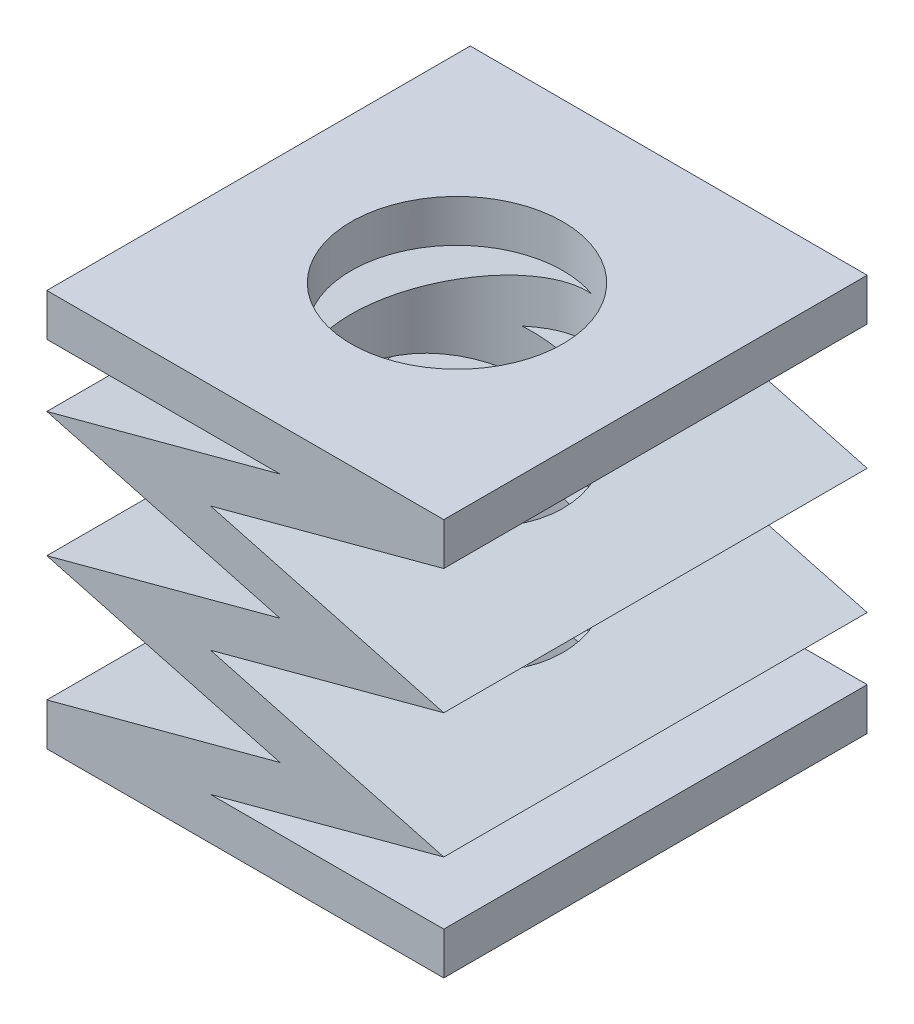
ISO-10303-21;
HEADER;
FILE_DESCRIPTION(('STEP AP214'),'2;1');
FILE_NAME('part.step','',(''),(''),'','','');
FILE_SCHEMA(('AUTOMOTIVE_DESIGN { 1 0 10303 214 1 1 1 1 }'));
ENDSEC;
DATA;
#1=APPLICATION_CONTEXT('core data for automotive mechanical design processes');
#2=APPLICATION_PROTOCOL_DEFINITION('international standard','automotive_design',2000,#1);
#3=PRODUCT_CONTEXT('',#1,'mechanical');
#4=PRODUCT('Part','Part','',(#3));
#5=PRODUCT_RELATED_PRODUCT_CATEGORY('part','',(#4));
#6=PRODUCT_DEFINITION_FORMATION('','',#4);
#7=PRODUCT_DEFINITION_CONTEXT('part definition',#1,'design');
#8=PRODUCT_DEFINITION('design','',#6,#7);
#9=PRODUCT_DEFINITION_SHAPE('','',#8);
#10=(LENGTH_UNIT() NAMED_UNIT(*) SI_UNIT(.MILLI.,.METRE.));
#11=(NAMED_UNIT(*) PLANE_ANGLE_UNIT() SI_UNIT($,.RADIAN.));
#12=(NAMED_UNIT(*) SI_UNIT($,.STERADIAN.) SOLID_ANGLE_UNIT());
#13=UNCERTAINTY_MEASURE_WITH_UNIT(LENGTH_MEASURE(1.E-05),#10,'distance_accuracy_value','');
#14=(GEOMETRIC_REPRESENTATION_CONTEXT(3) GLOBAL_UNCERTAINTY_ASSIGNED_CONTEXT((#13)) GLOBAL_UNIT_ASSIGNED_CONTEXT((#10,
#11,#12)) REPRESENTATION_CONTEXT('',''));
#15=CARTESIAN_POINT('',(0.,0.,0.));
#16=DIRECTION('',(0.,0.,1.));
#17=DIRECTION('',(1.,0.,0.));
#18=AXIS2_PLACEMENT_3D('',#15,#16,#17);
#19=CARTESIAN_POINT('',(7.5,0.,8.));
#20=DIRECTION('',(1.,0.,0.));
#21=DIRECTION('',(0.,0.,-1.));
#22=AXIS2_PLACEMENT_3D('',#19,#20,#21);
#23=PLANE('',#22);
#24=DIRECTION('',(0.,-1.,0.));
#25=VECTOR('',#24,1.);
#26=CARTESIAN_POINT('',(7.5,0.,0.));
#27=LINE('',#26,#25);
#28=CARTESIAN_POINT('',(7.5,0.,0.));
#29=VERTEX_POINT('',#28);
#30=CARTESIAN_POINT('',(7.5,-0.8,0.));
#31=VERTEX_POINT('',#30);
#32=EDGE_CURVE('E271',#29,#31,#27,.T.);
#33=ORIENTED_EDGE('',*,*,#32,.F.);
#34=DIRECTION('',(0.,0.,-1.));
#35=VECTOR('',#34,1.);
#36=CARTESIAN_POINT('',(7.5,0.,8.));
#37=LINE('',#36,#35);
#38=CARTESIAN_POINT('',(7.5,0.,8.));
#39=VERTEX_POINT('',#38);
#40=EDGE_CURVE('E11',#39,#29,#37,.T.);
#41=ORIENTED_EDGE('',*,*,#40,.F.);
#42=DIRECTION('',(0.,-1.,0.));
#43=VECTOR('',#42,1.);
#44=CARTESIAN_POINT('',(7.5,0.,8.));
#45=LINE('',#44,#43);
#46=CARTESIAN_POINT('',(7.5,-0.8,8.));
#47=VERTEX_POINT('',#46);
#48=EDGE_CURVE('E321',#39,#47,#45,.T.);
#49=ORIENTED_EDGE('',*,*,#48,.T.);
#50=DIRECTION('',(0.,0.,-1.));
#51=VECTOR('',#50,1.);
#52=CARTESIAN_POINT('',(7.5,-0.8,8.));
#53=LINE('',#52,#51);
#54=EDGE_CURVE('E322',#47,#31,#53,.T.);
#55=ORIENTED_EDGE('',*,*,#54,.T.);
#56=EDGE_LOOP('',(#33,#41,#49,#55));
#57=FACE_BOUND('',#56,.T.);
#58=ADVANCED_FACE('F35',(#57),#23,.T.);
#59=CARTESIAN_POINT('',(0.,0.,8.));
#60=DIRECTION('',(0.,1.,0.));
#61=DIRECTION('',(0.,0.,1.));
#62=AXIS2_PLACEMENT_3D('',#59,#60,#61);
#63=PLANE('',#62);
#64=CARTESIAN_POINT('',(3.75,0.,4.));
#65=DIRECTION('',(0.,1.,0.));
#66=DIRECTION('',(0.,0.,1.));
#67=AXIS2_PLACEMENT_3D('',#64,#65,#66);
#68=CIRCLE('',#67,2.);
#69=CARTESIAN_POINT('',(3.09302731039557,0.,5.88901743907089));
#70=VERTEX_POINT('',#69);
#71=CARTESIAN_POINT('',(3.09302731039557,0.,2.11098256092912));
#72=VERTEX_POINT('',#71);
#73=EDGE_CURVE('E48',#70,#72,#68,.T.);
#74=ORIENTED_EDGE('',*,*,#73,.F.);
#75=DIRECTION('',(0.,0.,-1.));
#76=VECTOR('',#75,1.);
#77=CARTESIAN_POINT('',(3.09302731039557,0.,8.));
#78=LINE('',#77,#76);
#79=CARTESIAN_POINT('',(3.09302731039557,0.,8.));
#80=VERTEX_POINT('',#79);
#81=EDGE_CURVE('E42',#80,#70,#78,.T.);
#82=ORIENTED_EDGE('',*,*,#81,.F.);
#83=DIRECTION('',(1.,0.,0.));
#84=VECTOR('',#83,1.);
#85=CARTESIAN_POINT('',(0.,0.,8.));
#86=LINE('',#85,#84);
#87=EDGE_CURVE('E344',#80,#39,#86,.T.);
#88=ORIENTED_EDGE('',*,*,#87,.T.);
#89=ORIENTED_EDGE('',*,*,#40,.T.);
#90=DIRECTION('',(1.,0.,0.));
#91=VECTOR('',#90,1.);
#92=CARTESIAN_POINT('',(0.,0.,0.));
#93=LINE('',#92,#91);
#94=CARTESIAN_POINT('',(3.09302731039557,0.,0.));
#95=VERTEX_POINT('',#94);
#96=EDGE_CURVE('E265',#95,#29,#93,.T.);
#97=ORIENTED_EDGE('',*,*,#96,.F.);
#98=EDGE_CURVE('E252',#72,#95,#78,.T.);
#99=ORIENTED_EDGE('',*,*,#98,.F.);
#100=EDGE_LOOP('',(#74,#82,#88,#89,#97,#99));
#101=FACE_BOUND('',#100,.T.);
#102=ADVANCED_FACE('F266',(#101),#63,.T.);
#103=CARTESIAN_POINT('',(0.206917021989744,-0.772777682138204,8.));
#104=DIRECTION('',(0.25864627748718,-0.965972102672756,0.));
#105=DIRECTION('',(0.965972102672756,0.25864627748718,0.));
#106=AXIS2_PLACEMENT_3D('',#103,#104,#105);
#107=PLANE('',#106);
#108=CARTESIAN_POINT('',(3.75,0.175909366436943,4.));
#109=DIRECTION('',(0.25864627748718,-0.965972102672756,0.));
#110=DIRECTION('',(-0.965972102672756,-0.25864627748718,0.));
#111=AXIS2_PLACEMENT_3D('',#108,#109,#110);
#112=ELLIPSE('',#111,2.07045316781529,2.);
#113=EDGE_CURVE('E262',#72,#70,#112,.T.);
#114=ORIENTED_EDGE('',*,*,#113,.F.);
#115=ORIENTED_EDGE('',*,*,#98,.T.);
#116=DIRECTION('',(-0.965972102672756,-0.25864627748718,0.));
#117=VECTOR('',#116,1.);
#118=CARTESIAN_POINT('',(0.206917021989744,-0.772777682138204,0.));
#119=LINE('',#118,#117);
#120=CARTESIAN_POINT('',(7.5,1.18,0.));
#121=VERTEX_POINT('',#120);
#122=EDGE_CURVE('E261',#121,#95,#119,.T.);
#123=ORIENTED_EDGE('',*,*,#122,.F.);
#124=DIRECTION('',(0.,0.,-1.));
#125=VECTOR('',#124,1.);
#126=CARTESIAN_POINT('',(7.5,1.18,8.));
#127=LINE('',#126,#125);
#128=CARTESIAN_POINT('',(7.5,1.18,8.));
#129=VERTEX_POINT('',#128);
#130=EDGE_CURVE('E251',#129,#121,#127,.T.);
#131=ORIENTED_EDGE('',*,*,#130,.F.);
#132=DIRECTION('',(-0.965972102672756,-0.25864627748718,0.));
#133=VECTOR('',#132,1.);
#134=CARTESIAN_POINT('',(0.206917021989744,-0.772777682138204,8.));
#135=LINE('',#134,#133);
#136=EDGE_CURVE('E346',#129,#80,#135,.T.);
#137=ORIENTED_EDGE('',*,*,#136,.T.);
#138=ORIENTED_EDGE('',*,*,#81,.T.);
#139=EDGE_LOOP('',(#114,#115,#123,#131,#137,#138));
#140=FACE_BOUND('',#139,.T.);
#141=ADVANCED_FACE('F259',(#140),#107,.T.);
#142=CARTESIAN_POINT('',(0.796551430879887,2.97489864555338,8.));
#143=DIRECTION('',(-0.25864627748718,-0.965972102672756,0.));
#144=DIRECTION('',(0.965972102672756,-0.25864627748718,0.));
#145=AXIS2_PLACEMENT_3D('',#142,#143,#144);
#146=PLANE('',#145);
#147=DIRECTION('',(0.,0.,-1.));
#148=VECTOR('',#147,1.);
#149=CARTESIAN_POINT('',(3.09302731039557,2.36,8.));
#150=LINE('',#149,#148);
#151=CARTESIAN_POINT('',(3.09302731039557,2.36,2.11098256092911));
#152=VERTEX_POINT('',#151);
#153=CARTESIAN_POINT('',(3.09302731039557,2.36,0.));
#154=VERTEX_POINT('',#153);
#155=EDGE_CURVE('E247',#152,#154,#150,.T.);
#156=ORIENTED_EDGE('',*,*,#155,.F.);
#157=CARTESIAN_POINT('',(3.75,2.18409063356306,4.));
#158=DIRECTION('',(-0.25864627748718,-0.965972102672756,0.));
#159=DIRECTION('',(0.965972102672756,-0.25864627748718,0.));
#160=AXIS2_PLACEMENT_3D('',#157,#158,#159);
#161=ELLIPSE('',#160,2.07045316781529,2.);
#162=CARTESIAN_POINT('',(3.09302731039557,2.36,5.88901743907089));
#163=VERTEX_POINT('',#162);
#164=EDGE_CURVE('E55',#152,#163,#161,.T.);
#165=ORIENTED_EDGE('',*,*,#164,.T.);
#166=CARTESIAN_POINT('',(3.09302731039557,2.36,8.));
#167=VERTEX_POINT('',#166);
#168=EDGE_CURVE('E248',#167,#163,#150,.T.);
#169=ORIENTED_EDGE('',*,*,#168,.F.);
#170=DIRECTION('',(-0.965972102672756,0.25864627748718,0.));
#171=VECTOR('',#170,1.);
#172=CARTESIAN_POINT('',(0.796551430879887,2.97489864555338,8.));
#173=LINE('',#172,#171);
#174=EDGE_CURVE('E352',#129,#167,#173,.T.);
#175=ORIENTED_EDGE('',*,*,#174,.F.);
#176=ORIENTED_EDGE('',*,*,#130,.T.);
#177=DIRECTION('',(-0.965972102672756,0.25864627748718,0.));
#178=VECTOR('',#177,1.);
#179=CARTESIAN_POINT('',(0.796551430879887,2.97489864555338,0.));
#180=LINE('',#179,#178);
#181=EDGE_CURVE('E277',#121,#154,#180,.T.);
#182=ORIENTED_EDGE('',*,*,#181,.T.);
#183=EDGE_LOOP('',(#156,#165,#169,#175,#176,#182));
#184=FACE_BOUND('',#183,.T.);
#185=ADVANCED_FACE('F427',(#184),#146,.F.);
#186=CARTESIAN_POINT('',(-0.382717386900399,1.42934328127697,8.));
#187=DIRECTION('',(0.25864627748718,-0.965972102672756,0.));
#188=DIRECTION('',(0.965972102672756,0.25864627748718,0.));
#189=AXIS2_PLACEMENT_3D('',#186,#187,#188);
#190=PLANE('',#189);
#191=CARTESIAN_POINT('',(3.75,2.53590936643694,4.));
#192=DIRECTION('',(0.25864627748718,-0.965972102672756,0.));
#193=DIRECTION('',(-0.965972102672756,-0.25864627748718,0.));
#194=AXIS2_PLACEMENT_3D('',#191,#192,#193);
#195=ELLIPSE('',#194,2.07045316781529,2.);
#196=EDGE_CURVE('E383',#152,#163,#195,.T.);
#197=ORIENTED_EDGE('',*,*,#196,.F.);
#198=ORIENTED_EDGE('',*,*,#155,.T.);
#199=DIRECTION('',(-0.965972102672756,-0.25864627748718,0.));
#200=VECTOR('',#199,1.);
#201=CARTESIAN_POINT('',(-0.382717386900399,1.42934328127697,0.));
#202=LINE('',#201,#200);
#203=CARTESIAN_POINT('',(7.5,3.54,0.));
#204=VERTEX_POINT('',#203);
#205=EDGE_CURVE('E279',#204,#154,#202,.T.);
#206=ORIENTED_EDGE('',*,*,#205,.F.);
#207=DIRECTION('',(0.,0.,-1.));
#208=VECTOR('',#207,1.);
#209=CARTESIAN_POINT('',(7.5,3.54,8.));
#210=LINE('',#209,#208);
#211=CARTESIAN_POINT('',(7.5,3.54,8.));
#212=VERTEX_POINT('',#211);
#213=EDGE_CURVE('E245',#212,#204,#210,.T.);
#214=ORIENTED_EDGE('',*,*,#213,.F.);
#215=DIRECTION('',(-0.965972102672756,-0.25864627748718,0.));
#216=VECTOR('',#215,1.);
#217=CARTESIAN_POINT('',(-0.382717386900399,1.42934328127697,8.));
#218=LINE('',#217,#216);
#219=EDGE_CURVE('E354',#212,#167,#218,.T.);
#220=ORIENTED_EDGE('',*,*,#219,.T.);
#221=ORIENTED_EDGE('',*,*,#168,.T.);
#222=EDGE_LOOP('',(#197,#198,#206,#214,#220,#221));
#223=FACE_BOUND('',#222,.T.);
#224=ADVANCED_FACE('F432',(#223),#190,.T.);
#225=CARTESIAN_POINT('',(1.38618583977003,5.17701960896856,8.));
#226=DIRECTION('',(-0.25864627748718,-0.965972102672756,0.));
#227=DIRECTION('',(0.965972102672756,-0.25864627748718,0.));
#228=AXIS2_PLACEMENT_3D('',#225,#226,#227);
#229=PLANE('',#228);
#230=DIRECTION('',(0.,0.,-1.));
#231=VECTOR('',#230,1.);
#232=CARTESIAN_POINT('',(3.09302731039557,4.72,8.));
#233=LINE('',#232,#231);
#234=CARTESIAN_POINT('',(3.09302731039557,4.72,2.11098256092911));
#235=VERTEX_POINT('',#234);
#236=CARTESIAN_POINT('',(3.09302731039557,4.72,0.));
#237=VERTEX_POINT('',#236);
#238=EDGE_CURVE('E241',#235,#237,#233,.T.);
#239=ORIENTED_EDGE('',*,*,#238,.F.);
#240=CARTESIAN_POINT('',(3.75,4.54409063356306,4.));
#241=DIRECTION('',(-0.25864627748718,-0.965972102672756,0.));
#242=DIRECTION('',(0.965972102672756,-0.25864627748718,0.));
#243=AXIS2_PLACEMENT_3D('',#240,#241,#242);
#244=ELLIPSE('',#243,2.07045316781529,2.);
#245=CARTESIAN_POINT('',(3.09302731039557,4.72,5.88901743907089));
#246=VERTEX_POINT('',#245);
#247=EDGE_CURVE('E387',#235,#246,#244,.T.);
#248=ORIENTED_EDGE('',*,*,#247,.T.);
#249=CARTESIAN_POINT('',(3.09302731039557,4.72,8.));
#250=VERTEX_POINT('',#249);
#251=EDGE_CURVE('E242',#250,#246,#233,.T.);
#252=ORIENTED_EDGE('',*,*,#251,.F.);
#253=DIRECTION('',(-0.965972102672756,0.25864627748718,0.));
#254=VECTOR('',#253,1.);
#255=CARTESIAN_POINT('',(1.38618583977003,5.17701960896856,8.));
#256=LINE('',#255,#254);
#257=EDGE_CURVE('E357',#212,#250,#256,.T.);
#258=ORIENTED_EDGE('',*,*,#257,.F.);
#259=ORIENTED_EDGE('',*,*,#213,.T.);
#260=DIRECTION('',(-0.965972102672756,0.25864627748718,0.));
#261=VECTOR('',#260,1.);
#262=CARTESIAN_POINT('',(1.38618583977003,5.17701960896856,0.));
#263=LINE('',#262,#261);
#264=EDGE_CURVE('E284',#204,#237,#263,.T.);
#265=ORIENTED_EDGE('',*,*,#264,.T.);
#266=EDGE_LOOP('',(#239,#248,#252,#258,#259,#265));
#267=FACE_BOUND('',#266,.T.);
#268=ADVANCED_FACE('F436',(#267),#229,.F.);
#269=CARTESIAN_POINT('',(-0.972351795790542,3.63146424469215,8.));
#270=DIRECTION('',(0.25864627748718,-0.965972102672756,0.));
#271=DIRECTION('',(0.965972102672756,0.25864627748718,0.));
#272=AXIS2_PLACEMENT_3D('',#269,#270,#271);
#273=PLANE('',#272);
#274=CARTESIAN_POINT('',(3.75,4.89590936643694,4.));
#275=DIRECTION('',(0.25864627748718,-0.965972102672756,0.));
#276=DIRECTION('',(-0.965972102672756,-0.25864627748718,0.));
#277=AXIS2_PLACEMENT_3D('',#274,#275,#276);
#278=ELLIPSE('',#277,2.07045316781529,2.);
#279=EDGE_CURVE('E390',#235,#246,#278,.T.);
#280=ORIENTED_EDGE('',*,*,#279,.F.);
#281=ORIENTED_EDGE('',*,*,#238,.T.);
#282=DIRECTION('',(-0.965972102672756,-0.25864627748718,0.));
#283=VECTOR('',#282,1.);
#284=CARTESIAN_POINT('',(-0.972351795790542,3.63146424469215,0.));
#285=LINE('',#284,#283);
#286=CARTESIAN_POINT('',(7.5,5.9,0.));
#287=VERTEX_POINT('',#286);
#288=EDGE_CURVE('E287',#287,#237,#285,.T.);
#289=ORIENTED_EDGE('',*,*,#288,.F.);
#290=DIRECTION('',(0.,0.,-1.));
#291=VECTOR('',#290,1.);
#292=CARTESIAN_POINT('',(7.5,5.9,8.));
#293=LINE('',#292,#291);
#294=CARTESIAN_POINT('',(7.5,5.9,8.));
#295=VERTEX_POINT('',#294);
#296=EDGE_CURVE('E239',#295,#287,#293,.T.);
#297=ORIENTED_EDGE('',*,*,#296,.F.);
#298=DIRECTION('',(-0.965972102672756,-0.25864627748718,0.));
#299=VECTOR('',#298,1.);
#300=CARTESIAN_POINT('',(-0.972351795790542,3.63146424469215,8.));
#301=LINE('',#300,#299);
#302=EDGE_CURVE('E359',#295,#250,#301,.T.);
#303=ORIENTED_EDGE('',*,*,#302,.T.);
#304=ORIENTED_EDGE('',*,*,#251,.T.);
#305=EDGE_LOOP('',(#280,#281,#289,#297,#303,#304));
#306=FACE_BOUND('',#305,.T.);
#307=ADVANCED_FACE('F440',(#306),#273,.T.);
#308=CARTESIAN_POINT('',(7.5,0.,8.));
#309=DIRECTION('',(-1.,0.,0.));
#310=DIRECTION('',(0.,0.,1.));
#311=AXIS2_PLACEMENT_3D('',#308,#309,#310);
#312=PLANE('',#311);
#313=DIRECTION('',(0.,1.,0.));
#314=VECTOR('',#313,1.);
#315=CARTESIAN_POINT('',(7.5,0.,0.));
#316=LINE('',#315,#314);
#317=CARTESIAN_POINT('',(7.5,6.7,0.));
#318=VERTEX_POINT('',#317);
#319=EDGE_CURVE('E290',#287,#318,#316,.T.);
#320=ORIENTED_EDGE('',*,*,#319,.T.);
#321=DIRECTION('',(0.,0.,-1.));
#322=VECTOR('',#321,1.);
#323=CARTESIAN_POINT('',(7.5,6.7,8.));
#324=LINE('',#323,#322);
#325=CARTESIAN_POINT('',(7.5,6.7,8.));
#326=VERTEX_POINT('',#325);
#327=EDGE_CURVE('E237',#326,#318,#324,.T.);
#328=ORIENTED_EDGE('',*,*,#327,.F.);
#329=DIRECTION('',(0.,1.,0.));
#330=VECTOR('',#329,1.);
#331=CARTESIAN_POINT('',(7.5,0.,8.));
#332=LINE('',#331,#330);
#333=EDGE_CURVE('E362',#295,#326,#332,.T.);
#334=ORIENTED_EDGE('',*,*,#333,.F.);
#335=ORIENTED_EDGE('',*,*,#296,.T.);
#336=EDGE_LOOP('',(#320,#328,#334,#335));
#337=FACE_BOUND('',#336,.T.);
#338=ADVANCED_FACE('F444',(#337),#312,.F.);
#339=CARTESIAN_POINT('',(0.,6.7,8.));
#340=DIRECTION('',(0.,1.,0.));
#341=DIRECTION('',(0.,0.,1.));
#342=AXIS2_PLACEMENT_3D('',#339,#340,#341);
#343=PLANE('',#342);
#344=CARTESIAN_POINT('',(3.75,6.7,4.));
#345=DIRECTION('',(0.,-1.,0.));
#346=DIRECTION('',(0.,0.,-1.));
#347=AXIS2_PLACEMENT_3D('',#344,#345,#346);
#348=CIRCLE('',#347,2.);
#349=CARTESIAN_POINT('',(3.75,6.7,2.));
#350=VERTEX_POINT('',#349);
#351=EDGE_CURVE('E201',#350,#350,#348,.T.);
#352=ORIENTED_EDGE('',*,*,#351,.T.);
#353=EDGE_LOOP('',(#352));
#354=FACE_BOUND('',#353,.T.);
#355=DIRECTION('',(1.,0.,0.));
#356=VECTOR('',#355,1.);
#357=CARTESIAN_POINT('',(0.,6.7,0.));
#358=LINE('',#357,#356);
#359=CARTESIAN_POINT('',(0.,6.7,0.));
#360=VERTEX_POINT('',#359);
#361=EDGE_CURVE('E293',#360,#318,#358,.T.);
#362=ORIENTED_EDGE('',*,*,#361,.F.);
#363=DIRECTION('',(0.,0.,-1.));
#364=VECTOR('',#363,1.);
#365=CARTESIAN_POINT('',(0.,6.7,8.));
#366=LINE('',#365,#364);
#367=CARTESIAN_POINT('',(0.,6.7,8.));
#368=VERTEX_POINT('',#367);
#369=EDGE_CURVE('E235',#368,#360,#366,.T.);
#370=ORIENTED_EDGE('',*,*,#369,.F.);
#371=DIRECTION('',(1.,0.,0.));
#372=VECTOR('',#371,1.);
#373=CARTESIAN_POINT('',(0.,6.7,8.));
#374=LINE('',#373,#372);
#375=EDGE_CURVE('E364',#368,#326,#374,.T.);
#376=ORIENTED_EDGE('',*,*,#375,.T.);
#377=ORIENTED_EDGE('',*,*,#327,.T.);
#378=EDGE_LOOP('',(#362,#370,#376,#377));
#379=FACE_BOUND('',#378,.T.);
#380=ADVANCED_FACE('F408',(#354,#379),#343,.T.);
#381=CARTESIAN_POINT('',(0.,0.,8.));
#382=DIRECTION('',(-1.,0.,0.));
#383=DIRECTION('',(0.,-1.,0.));
#384=AXIS2_PLACEMENT_3D('',#381,#382,#383);
#385=PLANE('',#384);
#386=DIRECTION('',(0.,1.,0.));
#387=VECTOR('',#386,1.);
#388=CARTESIAN_POINT('',(0.,0.,0.));
#389=LINE('',#388,#387);
#390=CARTESIAN_POINT('',(0.,5.9,0.));
#391=VERTEX_POINT('',#390);
#392=EDGE_CURVE('E296',#391,#360,#389,.T.);
#393=ORIENTED_EDGE('',*,*,#392,.F.);
#394=DIRECTION('',(0.,0.,-1.));
#395=VECTOR('',#394,1.);
#396=CARTESIAN_POINT('',(0.,5.9,8.));
#397=LINE('',#396,#395);
#398=CARTESIAN_POINT('',(0.,5.9,8.));
#399=VERTEX_POINT('',#398);
#400=EDGE_CURVE('E233',#399,#391,#397,.T.);
#401=ORIENTED_EDGE('',*,*,#400,.F.);
#402=DIRECTION('',(0.,1.,0.));
#403=VECTOR('',#402,1.);
#404=CARTESIAN_POINT('',(0.,0.,8.));
#405=LINE('',#404,#403);
#406=EDGE_CURVE('E367',#399,#368,#405,.T.);
#407=ORIENTED_EDGE('',*,*,#406,.T.);
#408=ORIENTED_EDGE('',*,*,#369,.T.);
#409=EDGE_LOOP('',(#393,#401,#407,#408));
#410=FACE_BOUND('',#409,.T.);
#411=ADVANCED_FACE('F451',(#410),#385,.T.);
#412=CARTESIAN_POINT('',(0.,5.9,8.));
#413=DIRECTION('',(0.,1.,0.));
#414=DIRECTION('',(0.,0.,1.));
#415=AXIS2_PLACEMENT_3D('',#412,#413,#414);
#416=PLANE('',#415);
#417=DIRECTION('',(0.,0.,-1.));
#418=VECTOR('',#417,1.);
#419=CARTESIAN_POINT('',(4.40697268960442,5.9,8.));
#420=LINE('',#419,#418);
#421=CARTESIAN_POINT('',(4.40697268960442,5.9,2.11098256092911));
#422=VERTEX_POINT('',#421);
#423=CARTESIAN_POINT('',(4.40697268960442,5.9,0.));
#424=VERTEX_POINT('',#423);
#425=EDGE_CURVE('E229',#422,#424,#420,.T.);
#426=ORIENTED_EDGE('',*,*,#425,.F.);
#427=CARTESIAN_POINT('',(3.75,5.9,4.));
#428=DIRECTION('',(0.,1.,0.));
#429=DIRECTION('',(0.,0.,1.));
#430=AXIS2_PLACEMENT_3D('',#427,#428,#429);
#431=CIRCLE('',#430,2.);
#432=CARTESIAN_POINT('',(4.40697268960442,5.9,5.88901743907089));
#433=VERTEX_POINT('',#432);
#434=EDGE_CURVE('E392',#422,#433,#431,.T.);
#435=ORIENTED_EDGE('',*,*,#434,.T.);
#436=CARTESIAN_POINT('',(4.40697268960442,5.9,8.));
#437=VERTEX_POINT('',#436);
#438=EDGE_CURVE('E230',#437,#433,#420,.T.);
#439=ORIENTED_EDGE('',*,*,#438,.F.);
#440=DIRECTION('',(1.,0.,0.));
#441=VECTOR('',#440,1.);
#442=CARTESIAN_POINT('',(0.,5.9,8.));
#443=LINE('',#442,#441);
#444=EDGE_CURVE('E370',#399,#437,#443,.T.);
#445=ORIENTED_EDGE('',*,*,#444,.F.);
#446=ORIENTED_EDGE('',*,*,#400,.T.);
#447=DIRECTION('',(1.,0.,0.));
#448=VECTOR('',#447,1.);
#449=CARTESIAN_POINT('',(0.,5.9,0.));
#450=LINE('',#449,#448);
#451=EDGE_CURVE('E299',#391,#424,#450,.T.);
#452=ORIENTED_EDGE('',*,*,#451,.T.);
#453=EDGE_LOOP('',(#426,#435,#439,#445,#446,#452));
#454=FACE_BOUND('',#453,.T.);
#455=ADVANCED_FACE('F454',(#454),#416,.F.);
#456=CARTESIAN_POINT('',(-1.17926881778029,4.40424192683036,8.));
#457=DIRECTION('',(0.25864627748718,-0.965972102672756,0.));
#458=DIRECTION('',(0.965972102672756,0.25864627748718,0.));
#459=AXIS2_PLACEMENT_3D('',#456,#457,#458);
#460=PLANE('',#459);
#461=ORIENTED_EDGE('',*,*,#438,.T.);
#462=CARTESIAN_POINT('',(3.75,5.72409063356306,4.));
#463=DIRECTION('',(0.25864627748718,-0.965972102672756,0.));
#464=DIRECTION('',(-0.965972102672756,-0.25864627748718,0.));
#465=AXIS2_PLACEMENT_3D('',#462,#463,#464);
#466=ELLIPSE('',#465,2.07045316781529,2.);
#467=EDGE_CURVE('E395',#433,#422,#466,.T.);
#468=ORIENTED_EDGE('',*,*,#467,.T.);
#469=ORIENTED_EDGE('',*,*,#425,.T.);
#470=DIRECTION('',(-0.965972102672756,-0.25864627748718,0.));
#471=VECTOR('',#470,1.);
#472=CARTESIAN_POINT('',(-1.17926881778029,4.40424192683036,0.));
#473=LINE('',#472,#471);
#474=CARTESIAN_POINT('',(0.,4.72,0.));
#475=VERTEX_POINT('',#474);
#476=EDGE_CURVE('E302',#424,#475,#473,.T.);
#477=ORIENTED_EDGE('',*,*,#476,.T.);
#478=DIRECTION('',(0.,0.,-1.));
#479=VECTOR('',#478,1.);
#480=CARTESIAN_POINT('',(0.,4.72,8.));
#481=LINE('',#480,#479);
#482=CARTESIAN_POINT('',(0.,4.72,8.));
#483=VERTEX_POINT('',#482);
#484=EDGE_CURVE('E227',#483,#475,#481,.T.);
#485=ORIENTED_EDGE('',*,*,#484,.F.);
#486=DIRECTION('',(-0.965972102672756,-0.25864627748718,0.));
#487=VECTOR('',#486,1.);
#488=CARTESIAN_POINT('',(-1.17926881778029,4.40424192683036,8.));
#489=LINE('',#488,#487);
#490=EDGE_CURVE('E372',#437,#483,#489,.T.);
#491=ORIENTED_EDGE('',*,*,#490,.F.);
#492=EDGE_LOOP('',(#461,#468,#469,#477,#485,#491));
#493=FACE_BOUND('',#492,.T.);
#494=ADVANCED_FACE('F458',(#493),#460,.F.);
#495=CARTESIAN_POINT('',(1.17926881778029,4.40424192683035,8.));
#496=DIRECTION('',(-0.25864627748718,-0.965972102672755,0.));
#497=DIRECTION('',(0.965972102672755,-0.25864627748718,0.));
#498=AXIS2_PLACEMENT_3D('',#495,#496,#497);
#499=PLANE('',#498);
#500=CARTESIAN_POINT('',(3.75,3.71590936643694,4.));
#501=DIRECTION('',(-0.25864627748718,-0.965972102672755,0.));
#502=DIRECTION('',(0.965972102672755,-0.25864627748718,0.));
#503=AXIS2_PLACEMENT_3D('',#500,#501,#502);
#504=ELLIPSE('',#503,2.07045316781529,2.);
#505=CARTESIAN_POINT('',(4.40697268960443,3.54,5.88901743907089));
#506=VERTEX_POINT('',#505);
#507=CARTESIAN_POINT('',(4.40697268960443,3.54,2.11098256092911));
#508=VERTEX_POINT('',#507);
#509=EDGE_CURVE('E398',#506,#508,#504,.T.);
#510=ORIENTED_EDGE('',*,*,#509,.F.);
#511=DIRECTION('',(0.,0.,-1.));
#512=VECTOR('',#511,1.);
#513=CARTESIAN_POINT('',(4.40697268960443,3.54,8.));
#514=LINE('',#513,#512);
#515=CARTESIAN_POINT('',(4.40697268960443,3.54,8.));
#516=VERTEX_POINT('',#515);
#517=EDGE_CURVE('E224',#516,#506,#514,.T.);
#518=ORIENTED_EDGE('',*,*,#517,.F.);
#519=DIRECTION('',(-0.965972102672755,0.25864627748718,0.));
#520=VECTOR('',#519,1.);
#521=CARTESIAN_POINT('',(1.17926881778029,4.40424192683035,8.));
#522=LINE('',#521,#520);
#523=EDGE_CURVE('E374',#516,#483,#522,.T.);
#524=ORIENTED_EDGE('',*,*,#523,.T.);
#525=ORIENTED_EDGE('',*,*,#484,.T.);
#526=DIRECTION('',(-0.965972102672755,0.25864627748718,0.));
#527=VECTOR('',#526,1.);
#528=CARTESIAN_POINT('',(1.17926881778029,4.40424192683035,0.));
#529=LINE('',#528,#527);
#530=CARTESIAN_POINT('',(4.40697268960443,3.54,0.));
#531=VERTEX_POINT('',#530);
#532=EDGE_CURVE('E305',#531,#475,#529,.T.);
#533=ORIENTED_EDGE('',*,*,#532,.F.);
#534=EDGE_CURVE('E218',#508,#531,#514,.T.);
#535=ORIENTED_EDGE('',*,*,#534,.F.);
#536=EDGE_LOOP('',(#510,#518,#524,#525,#533,#535));
#537=FACE_BOUND('',#536,.T.);
#538=ADVANCED_FACE('F462',(#537),#499,.T.);
#539=CARTESIAN_POINT('',(-0.589634408890143,2.20212096341518,8.));
#540=DIRECTION('',(0.25864627748718,-0.965972102672756,0.));
#541=DIRECTION('',(0.965972102672756,0.25864627748718,0.));
#542=AXIS2_PLACEMENT_3D('',#539,#540,#541);
#543=PLANE('',#542);
#544=ORIENTED_EDGE('',*,*,#517,.T.);
#545=CARTESIAN_POINT('',(3.75,3.36409063356306,4.));
#546=DIRECTION('',(0.25864627748718,-0.965972102672756,0.));
#547=DIRECTION('',(-0.965972102672756,-0.25864627748718,0.));
#548=AXIS2_PLACEMENT_3D('',#545,#546,#547);
#549=ELLIPSE('',#548,2.07045316781529,2.);
#550=EDGE_CURVE('E210',#506,#508,#549,.T.);
#551=ORIENTED_EDGE('',*,*,#550,.T.);
#552=ORIENTED_EDGE('',*,*,#534,.T.);
#553=DIRECTION('',(-0.965972102672756,-0.25864627748718,0.));
#554=VECTOR('',#553,1.);
#555=CARTESIAN_POINT('',(-0.589634408890143,2.20212096341518,0.));
#556=LINE('',#555,#554);
#557=CARTESIAN_POINT('',(0.,2.36,0.));
#558=VERTEX_POINT('',#557);
#559=EDGE_CURVE('E308',#531,#558,#556,.T.);
#560=ORIENTED_EDGE('',*,*,#559,.T.);
#561=DIRECTION('',(0.,0.,-1.));
#562=VECTOR('',#561,1.);
#563=CARTESIAN_POINT('',(0.,2.36,8.));
#564=LINE('',#563,#562);
#565=CARTESIAN_POINT('',(0.,2.36,8.));
#566=VERTEX_POINT('',#565);
#567=EDGE_CURVE('E216',#566,#558,#564,.T.);
#568=ORIENTED_EDGE('',*,*,#567,.F.);
#569=DIRECTION('',(-0.965972102672756,-0.25864627748718,0.));
#570=VECTOR('',#569,1.);
#571=CARTESIAN_POINT('',(-0.589634408890143,2.20212096341518,8.));
#572=LINE('',#571,#570);
#573=EDGE_CURVE('E377',#516,#566,#572,.T.);
#574=ORIENTED_EDGE('',*,*,#573,.F.);
#575=EDGE_LOOP('',(#544,#551,#552,#560,#568,#574));
#576=FACE_BOUND('',#575,.T.);
#577=ADVANCED_FACE('F466',(#576),#543,.F.);
#578=CARTESIAN_POINT('',(0.589634408890143,2.20212096341518,8.));
#579=DIRECTION('',(-0.25864627748718,-0.965972102672756,0.));
#580=DIRECTION('',(0.965972102672756,-0.25864627748718,0.));
#581=AXIS2_PLACEMENT_3D('',#578,#579,#580);
#582=PLANE('',#581);
#583=CARTESIAN_POINT('',(3.75,1.35590936643694,4.));
#584=DIRECTION('',(-0.25864627748718,-0.965972102672756,0.));
#585=DIRECTION('',(0.965972102672756,-0.25864627748718,0.));
#586=AXIS2_PLACEMENT_3D('',#583,#584,#585);
#587=ELLIPSE('',#586,2.07045316781529,2.);
#588=CARTESIAN_POINT('',(4.40697268960443,1.18,5.88901743907089));
#589=VERTEX_POINT('',#588);
#590=CARTESIAN_POINT('',(4.40697268960443,1.18,2.11098256092911));
#591=VERTEX_POINT('',#590);
#592=EDGE_CURVE('E197',#589,#591,#587,.T.);
#593=ORIENTED_EDGE('',*,*,#592,.F.);
#594=DIRECTION('',(0.,0.,-1.));
#595=VECTOR('',#594,1.);
#596=CARTESIAN_POINT('',(4.40697268960443,1.18,8.));
#597=LINE('',#596,#595);
#598=CARTESIAN_POINT('',(4.40697268960443,1.18,8.));
#599=VERTEX_POINT('',#598);
#600=EDGE_CURVE('E206',#599,#589,#597,.T.);
#601=ORIENTED_EDGE('',*,*,#600,.F.);
#602=DIRECTION('',(-0.965972102672756,0.25864627748718,0.));
#603=VECTOR('',#602,1.);
#604=CARTESIAN_POINT('',(0.589634408890143,2.20212096341518,8.));
#605=LINE('',#604,#603);
#606=EDGE_CURVE('E379',#599,#566,#605,.T.);
#607=ORIENTED_EDGE('',*,*,#606,.T.);
#608=ORIENTED_EDGE('',*,*,#567,.T.);
#609=DIRECTION('',(-0.965972102672756,0.25864627748718,0.));
#610=VECTOR('',#609,1.);
#611=CARTESIAN_POINT('',(0.589634408890143,2.20212096341518,0.));
#612=LINE('',#611,#610);
#613=CARTESIAN_POINT('',(4.40697268960443,1.18,0.));
#614=VERTEX_POINT('',#613);
#615=EDGE_CURVE('E311',#614,#558,#612,.T.);
#616=ORIENTED_EDGE('',*,*,#615,.F.);
#617=EDGE_CURVE('E209',#591,#614,#597,.T.);
#618=ORIENTED_EDGE('',*,*,#617,.F.);
#619=EDGE_LOOP('',(#593,#601,#607,#608,#616,#618));
#620=FACE_BOUND('',#619,.T.);
#621=ADVANCED_FACE('F204',(#620),#582,.T.);
#622=CARTESIAN_POINT('',(0.,0.,8.));
#623=DIRECTION('',(0.25864627748718,-0.965972102672756,0.));
#624=DIRECTION('',(0.965972102672756,0.25864627748718,0.));
#625=AXIS2_PLACEMENT_3D('',#622,#623,#624);
#626=PLANE('',#625);
#627=ORIENTED_EDGE('',*,*,#600,.T.);
#628=CARTESIAN_POINT('',(3.75,1.00409063356306,4.));
#629=DIRECTION('',(0.25864627748718,-0.965972102672756,0.));
#630=DIRECTION('',(-0.965972102672756,-0.25864627748718,0.));
#631=AXIS2_PLACEMENT_3D('',#628,#629,#630);
#632=ELLIPSE('',#631,2.07045316781529,2.);
#633=EDGE_CURVE('E193',#589,#591,#632,.T.);
#634=ORIENTED_EDGE('',*,*,#633,.T.);
#635=ORIENTED_EDGE('',*,*,#617,.T.);
#636=DIRECTION('',(-0.965972102672756,-0.25864627748718,0.));
#637=VECTOR('',#636,1.);
#638=CARTESIAN_POINT('',(0.,0.,0.));
#639=LINE('',#638,#637);
#640=CARTESIAN_POINT('',(0.,0.,0.));
#641=VERTEX_POINT('',#640);
#642=EDGE_CURVE('E314',#614,#641,#639,.T.);
#643=ORIENTED_EDGE('',*,*,#642,.T.);
#644=DIRECTION('',(0.,0.,-1.));
#645=VECTOR('',#644,1.);
#646=CARTESIAN_POINT('',(0.,0.,8.));
#647=LINE('',#646,#645);
#648=CARTESIAN_POINT('',(0.,0.,8.));
#649=VERTEX_POINT('',#648);
#650=EDGE_CURVE('E220',#649,#641,#647,.T.);
#651=ORIENTED_EDGE('',*,*,#650,.F.);
#652=DIRECTION('',(-0.965972102672756,-0.25864627748718,0.));
#653=VECTOR('',#652,1.);
#654=CARTESIAN_POINT('',(0.,0.,8.));
#655=LINE('',#654,#653);
#656=EDGE_CURVE('E214',#599,#649,#655,.T.);
#657=ORIENTED_EDGE('',*,*,#656,.F.);
#658=EDGE_LOOP('',(#627,#634,#635,#643,#651,#657));
#659=FACE_BOUND('',#658,.T.);
#660=ADVANCED_FACE('F212',(#659),#626,.F.);
#661=CARTESIAN_POINT('',(0.,0.,8.));
#662=DIRECTION('',(1.,0.,0.));
#663=DIRECTION('',(0.,0.,-1.));
#664=AXIS2_PLACEMENT_3D('',#661,#662,#663);
#665=PLANE('',#664);
#666=DIRECTION('',(0.,-1.,0.));
#667=VECTOR('',#666,1.);
#668=CARTESIAN_POINT('',(0.,0.,0.));
#669=LINE('',#668,#667);
#670=CARTESIAN_POINT('',(0.,-0.8,0.));
#671=VERTEX_POINT('',#670);
#672=EDGE_CURVE('E316',#641,#671,#669,.T.);
#673=ORIENTED_EDGE('',*,*,#672,.T.);
#674=DIRECTION('',(0.,0.,-1.));
#675=VECTOR('',#674,1.);
#676=CARTESIAN_POINT('',(0.,-0.8,8.));
#677=LINE('',#676,#675);
#678=CARTESIAN_POINT('',(0.,-0.8,8.));
#679=VERTEX_POINT('',#678);
#680=EDGE_CURVE('E323',#679,#671,#677,.T.);
#681=ORIENTED_EDGE('',*,*,#680,.F.);
#682=DIRECTION('',(0.,-1.,0.));
#683=VECTOR('',#682,1.);
#684=CARTESIAN_POINT('',(0.,0.,8.));
#685=LINE('',#684,#683);
#686=EDGE_CURVE('E335',#649,#679,#685,.T.);
#687=ORIENTED_EDGE('',*,*,#686,.F.);
#688=ORIENTED_EDGE('',*,*,#650,.T.);
#689=EDGE_LOOP('',(#673,#681,#687,#688));
#690=FACE_BOUND('',#689,.T.);
#691=ADVANCED_FACE('F334',(#690),#665,.F.);
#692=CARTESIAN_POINT('',(0.,-0.8,8.));
#693=DIRECTION('',(0.,1.,0.));
#694=DIRECTION('',(0.,0.,1.));
#695=AXIS2_PLACEMENT_3D('',#692,#693,#694);
#696=PLANE('',#695);
#697=CARTESIAN_POINT('',(3.75,-0.8,4.));
#698=DIRECTION('',(0.,-1.,0.));
#699=DIRECTION('',(0.,0.,-1.));
#700=AXIS2_PLACEMENT_3D('',#697,#698,#699);
#701=CIRCLE('',#700,2.);
#702=CARTESIAN_POINT('',(3.75,-0.8,2.));
#703=VERTEX_POINT('',#702);
#704=EDGE_CURVE('E402',#703,#703,#701,.T.);
#705=ORIENTED_EDGE('',*,*,#704,.F.);
#706=EDGE_LOOP('',(#705));
#707=FACE_BOUND('',#706,.T.);
#708=DIRECTION('',(1.,0.,0.));
#709=VECTOR('',#708,1.);
#710=CARTESIAN_POINT('',(0.,-0.8,0.));
#711=LINE('',#710,#709);
#712=EDGE_CURVE('E318',#671,#31,#711,.T.);
#713=ORIENTED_EDGE('',*,*,#712,.T.);
#714=ORIENTED_EDGE('',*,*,#54,.F.);
#715=DIRECTION('',(1.,0.,0.));
#716=VECTOR('',#715,1.);
#717=CARTESIAN_POINT('',(0.,-0.8,8.));
#718=LINE('',#717,#716);
#719=EDGE_CURVE('E324',#679,#47,#718,.T.);
#720=ORIENTED_EDGE('',*,*,#719,.F.);
#721=ORIENTED_EDGE('',*,*,#680,.T.);
#722=EDGE_LOOP('',(#713,#714,#720,#721));
#723=FACE_BOUND('',#722,.T.);
#724=ADVANCED_FACE('F338',(#707,#723),#696,.F.);
#725=CARTESIAN_POINT('',(0.,0.,8.));
#726=DIRECTION('',(0.,0.,1.));
#727=DIRECTION('',(1.,0.,0.));
#728=AXIS2_PLACEMENT_3D('',#725,#726,#727);
#729=PLANE('',#728);
#730=ORIENTED_EDGE('',*,*,#48,.F.);
#731=ORIENTED_EDGE('',*,*,#87,.F.);
#732=ORIENTED_EDGE('',*,*,#136,.F.);
#733=ORIENTED_EDGE('',*,*,#174,.T.);
#734=ORIENTED_EDGE('',*,*,#219,.F.);
#735=ORIENTED_EDGE('',*,*,#257,.T.);
#736=ORIENTED_EDGE('',*,*,#302,.F.);
#737=ORIENTED_EDGE('',*,*,#333,.T.);
#738=ORIENTED_EDGE('',*,*,#375,.F.);
#739=ORIENTED_EDGE('',*,*,#406,.F.);
#740=ORIENTED_EDGE('',*,*,#444,.T.);
#741=ORIENTED_EDGE('',*,*,#490,.T.);
#742=ORIENTED_EDGE('',*,*,#523,.F.);
#743=ORIENTED_EDGE('',*,*,#573,.T.);
#744=ORIENTED_EDGE('',*,*,#606,.F.);
#745=ORIENTED_EDGE('',*,*,#656,.T.);
#746=ORIENTED_EDGE('',*,*,#686,.T.);
#747=ORIENTED_EDGE('',*,*,#719,.T.);
#748=EDGE_LOOP('',(#730,#731,#732,#733,#734,#735,#736,#737,#738,#739,#740,#741,#742,#743,#744,
#745,#746,#747));
#749=FACE_BOUND('',#748,.T.);
#750=ADVANCED_FACE('F416',(#749),#729,.T.);
#751=CARTESIAN_POINT('',(0.,0.,0.));
#752=DIRECTION('',(0.,0.,1.));
#753=DIRECTION('',(1.,0.,0.));
#754=AXIS2_PLACEMENT_3D('',#751,#752,#753);
#755=PLANE('',#754);
#756=ORIENTED_EDGE('',*,*,#32,.T.);
#757=ORIENTED_EDGE('',*,*,#712,.F.);
#758=ORIENTED_EDGE('',*,*,#672,.F.);
#759=ORIENTED_EDGE('',*,*,#642,.F.);
#760=ORIENTED_EDGE('',*,*,#615,.T.);
#761=ORIENTED_EDGE('',*,*,#559,.F.);
#762=ORIENTED_EDGE('',*,*,#532,.T.);
#763=ORIENTED_EDGE('',*,*,#476,.F.);
#764=ORIENTED_EDGE('',*,*,#451,.F.);
#765=ORIENTED_EDGE('',*,*,#392,.T.);
#766=ORIENTED_EDGE('',*,*,#361,.T.);
#767=ORIENTED_EDGE('',*,*,#319,.F.);
#768=ORIENTED_EDGE('',*,*,#288,.T.);
#769=ORIENTED_EDGE('',*,*,#264,.F.);
#770=ORIENTED_EDGE('',*,*,#205,.T.);
#771=ORIENTED_EDGE('',*,*,#181,.F.);
#772=ORIENTED_EDGE('',*,*,#122,.T.);
#773=ORIENTED_EDGE('',*,*,#96,.T.);
#774=EDGE_LOOP('',(#756,#757,#758,#759,#760,#761,#762,#763,#764,#765,#766,#767,#768,#769,#770,
#771,#772,#773));
#775=FACE_BOUND('',#774,.T.);
#776=ADVANCED_FACE('F274',(#775),#755,.F.);
#777=CARTESIAN_POINT('',(3.75,6.7,4.));
#778=DIRECTION('',(0.,-1.,0.));
#779=DIRECTION('',(0.,0.,-1.));
#780=AXIS2_PLACEMENT_3D('',#777,#778,#779);
#781=CYLINDRICAL_SURFACE('',#780,2.);
#782=ORIENTED_EDGE('',*,*,#73,.T.);
#783=ORIENTED_EDGE('',*,*,#113,.T.);
#784=EDGE_LOOP('',(#782,#783));
#785=FACE_BOUND('',#784,.T.);
#786=ORIENTED_EDGE('',*,*,#279,.T.);
#787=ORIENTED_EDGE('',*,*,#247,.F.);
#788=EDGE_LOOP('',(#786,#787));
#789=FACE_BOUND('',#788,.T.);
#790=ORIENTED_EDGE('',*,*,#704,.T.);
#791=EDGE_LOOP('',(#790));
#792=FACE_BOUND('',#791,.T.);
#793=ORIENTED_EDGE('',*,*,#351,.F.);
#794=EDGE_LOOP('',(#793));
#795=FACE_BOUND('',#794,.T.);
#796=ORIENTED_EDGE('',*,*,#592,.T.);
#797=ORIENTED_EDGE('',*,*,#633,.F.);
#798=EDGE_LOOP('',(#796,#797));
#799=FACE_BOUND('',#798,.T.);
#800=ORIENTED_EDGE('',*,*,#509,.T.);
#801=ORIENTED_EDGE('',*,*,#550,.F.);
#802=EDGE_LOOP('',(#800,#801));
#803=FACE_BOUND('',#802,.T.);
#804=ORIENTED_EDGE('',*,*,#467,.F.);
#805=ORIENTED_EDGE('',*,*,#434,.F.);
#806=EDGE_LOOP('',(#804,#805));
#807=FACE_BOUND('',#806,.T.);
#808=ORIENTED_EDGE('',*,*,#196,.T.);
#809=ORIENTED_EDGE('',*,*,#164,.F.);
#810=EDGE_LOOP('',(#808,#809));
#811=FACE_BOUND('',#810,.T.);
#812=ADVANCED_FACE('F195',(#785,#789,#792,#795,#799,#803,#807,#811),#781,.F.);
#813=CLOSED_SHELL('',(#58,#102,#141,#185,#224,#268,#307,#338,#380,#411,#455,#494,#538,#577,#621,
#660,#691,#724,#750,#776,#812));
#814=MANIFOLD_SOLID_BREP('B2',#813);
#815=ADVANCED_BREP_SHAPE_REPRESENTATION('',(#18,#814),#14);
#816=SHAPE_DEFINITION_REPRESENTATION(#9,#815);
ENDSEC;
END-ISO-10303-21;
